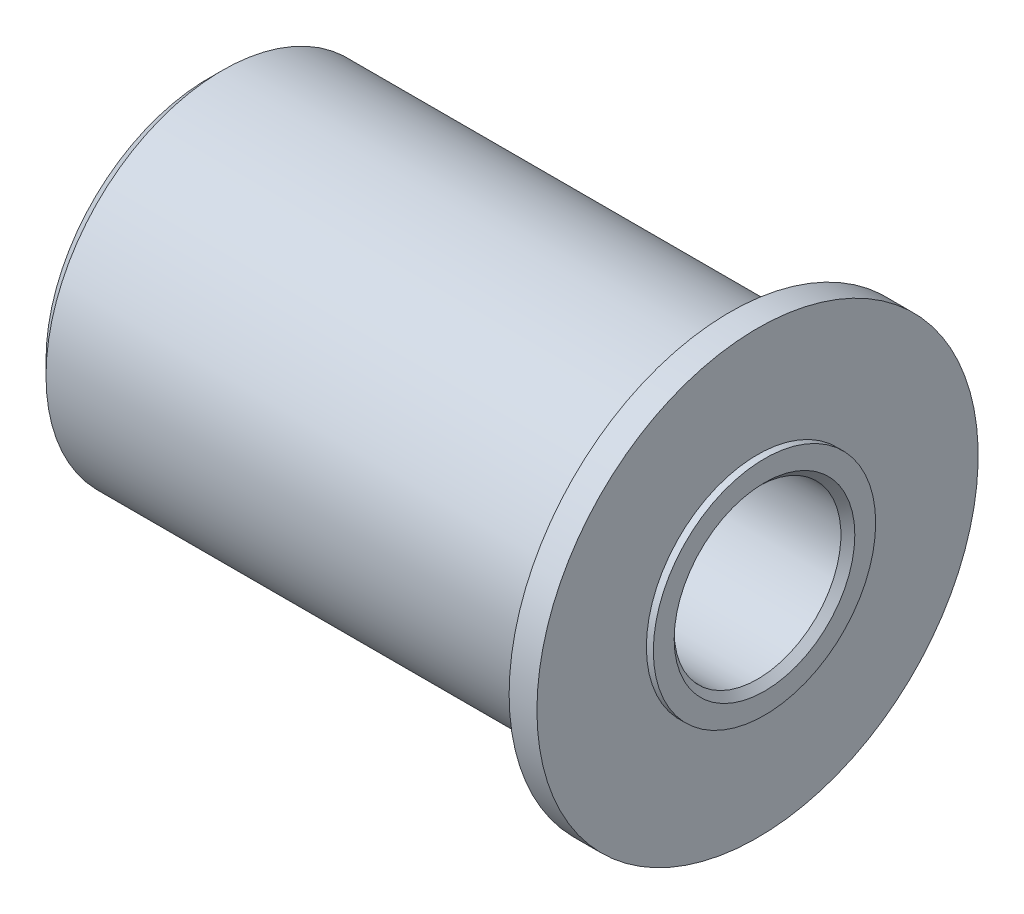
ISO-10303-21;
HEADER;
FILE_DESCRIPTION(('STEP AP214'),'2;1');
FILE_NAME('part.step','',(''),(''),'','','');
FILE_SCHEMA(('AUTOMOTIVE_DESIGN { 1 0 10303 214 1 1 1 1 }'));
ENDSEC;
DATA;
#1=APPLICATION_CONTEXT('core data for automotive mechanical design processes');
#2=APPLICATION_PROTOCOL_DEFINITION('international standard','automotive_design',2000,#1);
#3=PRODUCT_CONTEXT('',#1,'mechanical');
#4=PRODUCT('Part','Part','',(#3));
#5=PRODUCT_RELATED_PRODUCT_CATEGORY('part','',(#4));
#6=PRODUCT_DEFINITION_FORMATION('','',#4);
#7=PRODUCT_DEFINITION_CONTEXT('part definition',#1,'design');
#8=PRODUCT_DEFINITION('design','',#6,#7);
#9=PRODUCT_DEFINITION_SHAPE('','',#8);
#10=(LENGTH_UNIT() NAMED_UNIT(*) SI_UNIT(.MILLI.,.METRE.));
#11=(NAMED_UNIT(*) PLANE_ANGLE_UNIT() SI_UNIT($,.RADIAN.));
#12=(NAMED_UNIT(*) SI_UNIT($,.STERADIAN.) SOLID_ANGLE_UNIT());
#13=UNCERTAINTY_MEASURE_WITH_UNIT(LENGTH_MEASURE(1.E-05),#10,'distance_accuracy_value','');
#14=(GEOMETRIC_REPRESENTATION_CONTEXT(3) GLOBAL_UNCERTAINTY_ASSIGNED_CONTEXT((#13)) GLOBAL_UNIT_ASSIGNED_CONTEXT((#10,
#11,#12)) REPRESENTATION_CONTEXT('',''));
#15=CARTESIAN_POINT('',(0.,0.,0.));
#16=DIRECTION('',(0.,0.,1.));
#17=DIRECTION('',(1.,0.,0.));
#18=AXIS2_PLACEMENT_3D('',#15,#16,#17);
#19=CARTESIAN_POINT('',(1.,0.,0.));
#20=DIRECTION('',(1.,0.,0.));
#21=DIRECTION('',(0.,0.,-1.));
#22=AXIS2_PLACEMENT_3D('',#19,#20,#21);
#23=CONICAL_SURFACE('',#22,12.7,0.785398163397449);
#24=CARTESIAN_POINT('',(0.,0.,0.));
#25=DIRECTION('',(-1.,0.,0.));
#26=DIRECTION('',(0.,0.,1.));
#27=AXIS2_PLACEMENT_3D('',#24,#25,#26);
#28=CIRCLE('',#27,11.7);
#29=CARTESIAN_POINT('',(0.,0.,11.7));
#30=VERTEX_POINT('',#29);
#31=EDGE_CURVE('E67',#30,#30,#28,.T.);
#32=ORIENTED_EDGE('',*,*,#31,.F.);
#33=EDGE_LOOP('',(#32));
#34=FACE_BOUND('',#33,.T.);
#35=CARTESIAN_POINT('',(1.,0.,0.));
#36=DIRECTION('',(-1.,0.,0.));
#37=DIRECTION('',(0.,0.,1.));
#38=AXIS2_PLACEMENT_3D('',#35,#36,#37);
#39=CIRCLE('',#38,12.7);
#40=CARTESIAN_POINT('',(1.,0.,12.7));
#41=VERTEX_POINT('',#40);
#42=EDGE_CURVE('E10',#41,#41,#39,.T.);
#43=ORIENTED_EDGE('',*,*,#42,.T.);
#44=EDGE_LOOP('',(#43));
#45=FACE_BOUND('',#44,.T.);
#46=ADVANCED_FACE('F30',(#34,#45),#23,.T.);
#47=CARTESIAN_POINT('',(0.,0.,0.));
#48=DIRECTION('',(-1.,0.,0.));
#49=DIRECTION('',(0.,0.,1.));
#50=AXIS2_PLACEMENT_3D('',#47,#48,#49);
#51=CYLINDRICAL_SURFACE('',#50,12.7);
#52=ORIENTED_EDGE('',*,*,#42,.F.);
#53=EDGE_LOOP('',(#52));
#54=FACE_BOUND('',#53,.T.);
#55=CARTESIAN_POINT('',(37.5,0.,0.));
#56=DIRECTION('',(-1.,0.,0.));
#57=DIRECTION('',(0.,0.,1.));
#58=AXIS2_PLACEMENT_3D('',#55,#56,#57);
#59=CIRCLE('',#58,12.7);
#60=CARTESIAN_POINT('',(37.5,0.,12.7));
#61=VERTEX_POINT('',#60);
#62=EDGE_CURVE('E36',#61,#61,#59,.T.);
#63=ORIENTED_EDGE('',*,*,#62,.T.);
#64=EDGE_LOOP('',(#63));
#65=FACE_BOUND('',#64,.T.);
#66=ADVANCED_FACE('F74',(#54,#65),#51,.T.);
#67=CARTESIAN_POINT('',(37.5,15.875,0.));
#68=DIRECTION('',(1.,0.,0.));
#69=DIRECTION('',(0.,0.,-1.));
#70=AXIS2_PLACEMENT_3D('',#67,#68,#69);
#71=PLANE('',#70);
#72=ORIENTED_EDGE('',*,*,#62,.F.);
#73=EDGE_LOOP('',(#72));
#74=FACE_BOUND('',#73,.T.);
#75=CARTESIAN_POINT('',(37.5,0.,0.));
#76=DIRECTION('',(-1.,0.,0.));
#77=DIRECTION('',(0.,0.,1.));
#78=AXIS2_PLACEMENT_3D('',#75,#76,#77);
#79=CIRCLE('',#78,15.875);
#80=CARTESIAN_POINT('',(37.5,0.,15.875));
#81=VERTEX_POINT('',#80);
#82=EDGE_CURVE('E40',#81,#81,#79,.T.);
#83=ORIENTED_EDGE('',*,*,#82,.T.);
#84=EDGE_LOOP('',(#83));
#85=FACE_BOUND('',#84,.T.);
#86=ADVANCED_FACE('F78',(#74,#85),#71,.F.);
#87=CARTESIAN_POINT('',(0.,0.,0.));
#88=DIRECTION('',(-1.,0.,0.));
#89=DIRECTION('',(0.,0.,1.));
#90=AXIS2_PLACEMENT_3D('',#87,#88,#89);
#91=CYLINDRICAL_SURFACE('',#90,15.875);
#92=ORIENTED_EDGE('',*,*,#82,.F.);
#93=EDGE_LOOP('',(#92));
#94=FACE_BOUND('',#93,.T.);
#95=CARTESIAN_POINT('',(39.5,0.,0.));
#96=DIRECTION('',(-1.,0.,0.));
#97=DIRECTION('',(0.,0.,1.));
#98=AXIS2_PLACEMENT_3D('',#95,#96,#97);
#99=CIRCLE('',#98,15.875);
#100=CARTESIAN_POINT('',(39.5,0.,15.875));
#101=VERTEX_POINT('',#100);
#102=EDGE_CURVE('E44',#101,#101,#99,.T.);
#103=ORIENTED_EDGE('',*,*,#102,.T.);
#104=EDGE_LOOP('',(#103));
#105=FACE_BOUND('',#104,.T.);
#106=ADVANCED_FACE('F83',(#94,#105),#91,.T.);
#107=CARTESIAN_POINT('',(39.5,15.875,0.));
#108=DIRECTION('',(-1.,0.,0.));
#109=DIRECTION('',(0.,0.,1.));
#110=AXIS2_PLACEMENT_3D('',#107,#108,#109);
#111=PLANE('',#110);
#112=ORIENTED_EDGE('',*,*,#102,.F.);
#113=EDGE_LOOP('',(#112));
#114=FACE_BOUND('',#113,.T.);
#115=CARTESIAN_POINT('',(39.5,0.,0.));
#116=DIRECTION('',(-1.,0.,0.));
#117=DIRECTION('',(0.,0.,1.));
#118=AXIS2_PLACEMENT_3D('',#115,#116,#117);
#119=CIRCLE('',#118,8.);
#120=CARTESIAN_POINT('',(39.5,0.,8.));
#121=VERTEX_POINT('',#120);
#122=EDGE_CURVE('E49',#121,#121,#119,.T.);
#123=ORIENTED_EDGE('',*,*,#122,.T.);
#124=EDGE_LOOP('',(#123));
#125=FACE_BOUND('',#124,.T.);
#126=ADVANCED_FACE('F89',(#114,#125),#111,.F.);
#127=CARTESIAN_POINT('',(0.,0.,0.));
#128=DIRECTION('',(-1.,0.,0.));
#129=DIRECTION('',(0.,0.,1.));
#130=AXIS2_PLACEMENT_3D('',#127,#128,#129);
#131=CYLINDRICAL_SURFACE('',#130,8.);
#132=ORIENTED_EDGE('',*,*,#122,.F.);
#133=EDGE_LOOP('',(#132));
#134=FACE_BOUND('',#133,.T.);
#135=CARTESIAN_POINT('',(40.,0.,0.));
#136=DIRECTION('',(-1.,0.,0.));
#137=DIRECTION('',(0.,0.,1.));
#138=AXIS2_PLACEMENT_3D('',#135,#136,#137);
#139=CIRCLE('',#138,8.);
#140=CARTESIAN_POINT('',(40.,0.,8.));
#141=VERTEX_POINT('',#140);
#142=EDGE_CURVE('E52',#141,#141,#139,.T.);
#143=ORIENTED_EDGE('',*,*,#142,.T.);
#144=EDGE_LOOP('',(#143));
#145=FACE_BOUND('',#144,.T.);
#146=ADVANCED_FACE('F93',(#134,#145),#131,.T.);
#147=CARTESIAN_POINT('',(40.,8.00000000000001,0.));
#148=DIRECTION('',(-1.,0.,0.));
#149=DIRECTION('',(0.,0.,1.));
#150=AXIS2_PLACEMENT_3D('',#147,#148,#149);
#151=PLANE('',#150);
#152=ORIENTED_EDGE('',*,*,#142,.F.);
#153=EDGE_LOOP('',(#152));
#154=FACE_BOUND('',#153,.T.);
#155=CARTESIAN_POINT('',(40.,0.,0.));
#156=DIRECTION('',(-1.,0.,0.));
#157=DIRECTION('',(0.,0.,1.));
#158=AXIS2_PLACEMENT_3D('',#155,#156,#157);
#159=CIRCLE('',#158,6.5);
#160=CARTESIAN_POINT('',(40.,0.,6.5));
#161=VERTEX_POINT('',#160);
#162=EDGE_CURVE('E55',#161,#161,#159,.T.);
#163=ORIENTED_EDGE('',*,*,#162,.T.);
#164=EDGE_LOOP('',(#163));
#165=FACE_BOUND('',#164,.T.);
#166=ADVANCED_FACE('F97',(#154,#165),#151,.F.);
#167=CARTESIAN_POINT('',(39.5,0.,0.));
#168=DIRECTION('',(1.,0.,0.));
#169=DIRECTION('',(0.,0.,-1.));
#170=AXIS2_PLACEMENT_3D('',#167,#168,#169);
#171=CONICAL_SURFACE('',#170,6.,0.785398163397448);
#172=ORIENTED_EDGE('',*,*,#162,.F.);
#173=EDGE_LOOP('',(#172));
#174=FACE_BOUND('',#173,.T.);
#175=CARTESIAN_POINT('',(39.5,0.,0.));
#176=DIRECTION('',(-1.,0.,0.));
#177=DIRECTION('',(0.,0.,1.));
#178=AXIS2_PLACEMENT_3D('',#175,#176,#177);
#179=CIRCLE('',#178,6.);
#180=CARTESIAN_POINT('',(39.5,0.,6.));
#181=VERTEX_POINT('',#180);
#182=EDGE_CURVE('E58',#181,#181,#179,.T.);
#183=ORIENTED_EDGE('',*,*,#182,.T.);
#184=EDGE_LOOP('',(#183));
#185=FACE_BOUND('',#184,.T.);
#186=ADVANCED_FACE('F101',(#174,#185),#171,.F.);
#187=CARTESIAN_POINT('',(0.,0.,0.));
#188=DIRECTION('',(-1.,0.,0.));
#189=DIRECTION('',(0.,0.,1.));
#190=AXIS2_PLACEMENT_3D('',#187,#188,#189);
#191=CYLINDRICAL_SURFACE('',#190,6.);
#192=ORIENTED_EDGE('',*,*,#182,.F.);
#193=EDGE_LOOP('',(#192));
#194=FACE_BOUND('',#193,.T.);
#195=CARTESIAN_POINT('',(1.,0.,0.));
#196=DIRECTION('',(-1.,0.,0.));
#197=DIRECTION('',(0.,0.,1.));
#198=AXIS2_PLACEMENT_3D('',#195,#196,#197);
#199=CIRCLE('',#198,6.);
#200=CARTESIAN_POINT('',(1.,0.,6.));
#201=VERTEX_POINT('',#200);
#202=EDGE_CURVE('E61',#201,#201,#199,.T.);
#203=ORIENTED_EDGE('',*,*,#202,.T.);
#204=EDGE_LOOP('',(#203));
#205=FACE_BOUND('',#204,.T.);
#206=ADVANCED_FACE('F105',(#194,#205),#191,.F.);
#207=CARTESIAN_POINT('',(0.,0.,0.));
#208=DIRECTION('',(-1.,0.,0.));
#209=DIRECTION('',(0.,0.,1.));
#210=AXIS2_PLACEMENT_3D('',#207,#208,#209);
#211=CONICAL_SURFACE('',#210,7.,0.785398163397448);
#212=ORIENTED_EDGE('',*,*,#202,.F.);
#213=EDGE_LOOP('',(#212));
#214=FACE_BOUND('',#213,.T.);
#215=CARTESIAN_POINT('',(0.,0.,0.));
#216=DIRECTION('',(-1.,0.,0.));
#217=DIRECTION('',(0.,0.,1.));
#218=AXIS2_PLACEMENT_3D('',#215,#216,#217);
#219=CIRCLE('',#218,7.);
#220=CARTESIAN_POINT('',(0.,0.,7.));
#221=VERTEX_POINT('',#220);
#222=EDGE_CURVE('E64',#221,#221,#219,.T.);
#223=ORIENTED_EDGE('',*,*,#222,.T.);
#224=EDGE_LOOP('',(#223));
#225=FACE_BOUND('',#224,.T.);
#226=ADVANCED_FACE('F109',(#214,#225),#211,.F.);
#227=CARTESIAN_POINT('',(0.,11.7,0.));
#228=DIRECTION('',(1.,0.,0.));
#229=DIRECTION('',(0.,0.,-1.));
#230=AXIS2_PLACEMENT_3D('',#227,#228,#229);
#231=PLANE('',#230);
#232=ORIENTED_EDGE('',*,*,#222,.F.);
#233=EDGE_LOOP('',(#232));
#234=FACE_BOUND('',#233,.T.);
#235=ORIENTED_EDGE('',*,*,#31,.T.);
#236=EDGE_LOOP('',(#235));
#237=FACE_BOUND('',#236,.T.);
#238=ADVANCED_FACE('F71',(#234,#237),#231,.F.);
#239=CLOSED_SHELL('',(#46,#66,#86,#106,#126,#146,#166,#186,#206,#226,#238));
#240=MANIFOLD_SOLID_BREP('B2',#239);
#241=ADVANCED_BREP_SHAPE_REPRESENTATION('',(#18,#240),#14);
#242=SHAPE_DEFINITION_REPRESENTATION(#9,#241);
ENDSEC;
END-ISO-10303-21;
